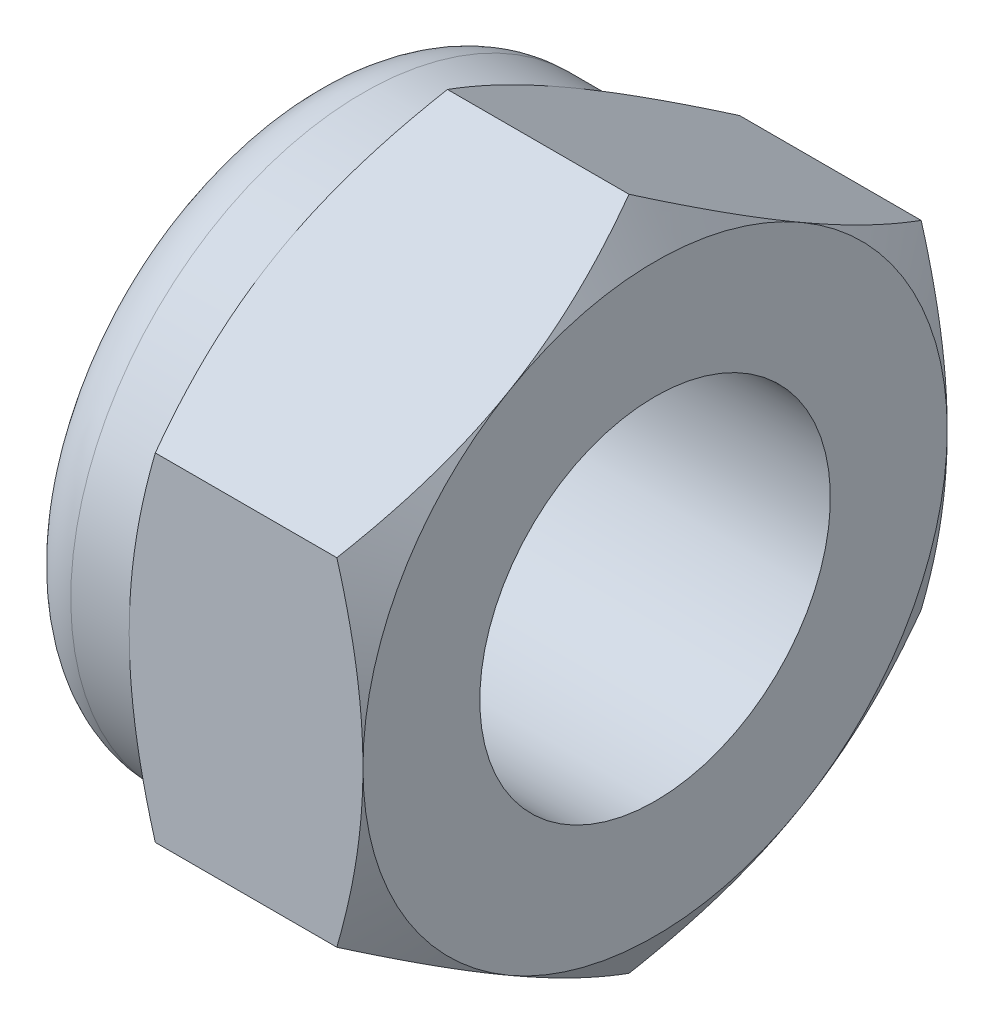
ISO-10303-21;
HEADER;
FILE_DESCRIPTION(('STEP AP214'),'2;1');
FILE_NAME('part.step','',(''),(''),'','','');
FILE_SCHEMA(('AUTOMOTIVE_DESIGN { 1 0 10303 214 1 1 1 1 }'));
ENDSEC;
DATA;
#1=APPLICATION_CONTEXT('core data for automotive mechanical design processes');
#2=APPLICATION_PROTOCOL_DEFINITION('international standard','automotive_design',2000,#1);
#3=PRODUCT_CONTEXT('',#1,'mechanical');
#4=PRODUCT('Part','Part','',(#3));
#5=PRODUCT_RELATED_PRODUCT_CATEGORY('part','',(#4));
#6=PRODUCT_DEFINITION_FORMATION('','',#4);
#7=PRODUCT_DEFINITION_CONTEXT('part definition',#1,'design');
#8=PRODUCT_DEFINITION('design','',#6,#7);
#9=PRODUCT_DEFINITION_SHAPE('','',#8);
#10=(LENGTH_UNIT() NAMED_UNIT(*) SI_UNIT(.MILLI.,.METRE.));
#11=(NAMED_UNIT(*) PLANE_ANGLE_UNIT() SI_UNIT($,.RADIAN.));
#12=(NAMED_UNIT(*) SI_UNIT($,.STERADIAN.) SOLID_ANGLE_UNIT());
#13=UNCERTAINTY_MEASURE_WITH_UNIT(LENGTH_MEASURE(1.E-05),#10,'distance_accuracy_value','');
#14=(GEOMETRIC_REPRESENTATION_CONTEXT(3) GLOBAL_UNCERTAINTY_ASSIGNED_CONTEXT((#13)) GLOBAL_UNIT_ASSIGNED_CONTEXT((#10,
#11,#12)) REPRESENTATION_CONTEXT('',''));
#15=CARTESIAN_POINT('',(0.,0.,0.));
#16=DIRECTION('',(0.,0.,1.));
#17=DIRECTION('',(1.,0.,0.));
#18=AXIS2_PLACEMENT_3D('',#15,#16,#17);
#19=CARTESIAN_POINT('',(-6.,2.88675134594813,-5.));
#20=DIRECTION('',(0.,0.866025403784439,-0.5));
#21=DIRECTION('',(0.,0.5,0.866025403784439));
#22=AXIS2_PLACEMENT_3D('',#19,#20,#21);
#23=PLANE('',#22);
#24=DIRECTION('',(1.,0.,0.));
#25=VECTOR('',#24,1.);
#26=CARTESIAN_POINT('',(-6.,2.88675134594813,-5.));
#27=LINE('',#26,#25);
#28=CARTESIAN_POINT('',(-3.5534180126148,2.88675134594813,-5.));
#29=VERTEX_POINT('',#28);
#30=CARTESIAN_POINT('',(-0.446581987385198,2.88675134594813,-5.));
#31=VERTEX_POINT('',#30);
#32=EDGE_CURVE('E160',#29,#31,#27,.T.);
#33=ORIENTED_EDGE('',*,*,#32,.F.);
#34=CARTESIAN_POINT('',(-3.55335134394818,2.88663587589429,-5.0002));
#35=CARTESIAN_POINT('',(-3.62661343236237,3.01349970319368,-4.78046540547481));
#36=CARTESIAN_POINT('',(-3.69324867808191,3.14144859993849,-4.55885141554042));
#37=CARTESIAN_POINT('',(-3.80956100898919,3.39956193532121,-4.11178600454649));
#38=CARTESIAN_POINT('',(-3.85919695008421,3.52973095989718,-3.88632664040923));
#39=CARTESIAN_POINT('',(-3.9364489745813,3.78847564779798,-3.43816769477649));
#40=CARTESIAN_POINT('',(-3.96457962171651,3.91701101576052,-3.21553790689581));
#41=CARTESIAN_POINT('',(-3.98980507804632,4.11026620624322,-2.88081009815336));
#42=CARTESIAN_POINT('',(-3.99538654023052,4.17472868879311,-2.76915780319494));
#43=CARTESIAN_POINT('',(-4.00079778324853,4.30371322717528,-2.5457500293262));
#44=CARTESIAN_POINT('',(-4.0006277417418,4.36823528110589,-2.43399455370969));
#45=CARTESIAN_POINT('',(-3.99224636820796,4.54500768479194,-2.12781576914936));
#46=CARTESIAN_POINT('',(-3.97817022810275,4.65719946015292,-1.93349391403279));
#47=CARTESIAN_POINT('',(-3.93353474289057,4.88083840557981,-1.5461398980023));
#48=CARTESIAN_POINT('',(-3.90296013985249,4.9922847895602,-1.35310909862843));
#49=CARTESIAN_POINT('',(-3.82653150637884,5.21637431361295,-0.964974657525147));
#50=CARTESIAN_POINT('',(-3.78035362112132,5.32898917185759,-0.769920001358265));
#51=CARTESIAN_POINT('',(-3.67554820550807,5.55253939626498,-0.382719654641233));
#52=CARTESIAN_POINT('',(-3.61694529656263,5.66347762579592,-0.190569004591914));
#53=CARTESIAN_POINT('',(-3.55335134394817,5.7736181619501,0.000199999999999449));
#54=B_SPLINE_CURVE_WITH_KNOTS('',3,(#34,#35,#36,#37,#38,#39,#40,#41,#42,#43,#44,#45,#46,#47,#48,
#49,#50,#51,#52,#53),.UNSPECIFIED.,.F.,.F.,(4,2,2,2,2,2,2,2,2,4),(0.,0.79255584136309,
1.58701660053333,2.3618153748728,2.74884076077325,3.13585419177295,3.80962362599679,
4.48401723901189,5.17336882348928,5.86136694793725),.UNSPECIFIED.);
#55=CARTESIAN_POINT('',(-4.,4.3301270189222,-2.5));
#56=VERTEX_POINT('',#55);
#57=EDGE_CURVE('E280',#29,#56,#54,.T.);
#58=ORIENTED_EDGE('',*,*,#57,.T.);
#59=CARTESIAN_POINT('',(-3.5534180126148,5.77350269189626,0.));
#60=VERTEX_POINT('',#59);
#61=EDGE_CURVE('E274',#56,#60,#54,.T.);
#62=ORIENTED_EDGE('',*,*,#61,.T.);
#63=DIRECTION('',(1.,0.,0.));
#64=VECTOR('',#63,1.);
#65=CARTESIAN_POINT('',(-6.,5.77350269189626,0.));
#66=LINE('',#65,#64);
#67=CARTESIAN_POINT('',(-0.446581987385199,5.77350269189626,0.));
#68=VERTEX_POINT('',#67);
#69=EDGE_CURVE('E167',#60,#68,#66,.T.);
#70=ORIENTED_EDGE('',*,*,#69,.T.);
#71=CARTESIAN_POINT('',(-0.446648656051826,5.7736181619501,0.000199999999999896));
#72=CARTESIAN_POINT('',(-0.373386567637632,5.64675433465071,-0.219534594525186));
#73=CARTESIAN_POINT('',(-0.30675132191809,5.5188054379059,-0.441148584459581));
#74=CARTESIAN_POINT('',(-0.19043899101081,5.26069210252318,-0.888213995453513));
#75=CARTESIAN_POINT('',(-0.140803049915788,5.13052307794721,-1.11367335959077));
#76=CARTESIAN_POINT('',(-0.063551025418698,4.87177839004641,-1.56183230522351));
#77=CARTESIAN_POINT('',(-0.0354203782834895,4.74324302208387,-1.78446209310419));
#78=CARTESIAN_POINT('',(-0.0101949219536849,4.54998783160116,-2.11918990184664));
#79=CARTESIAN_POINT('',(-0.00461345976948452,4.48552534905128,-2.23084219680506));
#80=CARTESIAN_POINT('',(0.000797783248529286,4.35654081066911,-2.4542499706738));
#81=CARTESIAN_POINT('',(0.000627741741796299,4.2920187567385,-2.56600544629031));
#82=CARTESIAN_POINT('',(-0.00775363179203673,4.11524635305244,-2.87218423085064));
#83=CARTESIAN_POINT('',(-0.021829771897252,4.00305457769146,-3.06650608596721));
#84=CARTESIAN_POINT('',(-0.066465257109431,3.77941563226458,-3.4538601019977));
#85=CARTESIAN_POINT('',(-0.0970398601475077,3.66796924828419,-3.64689090137157));
#86=CARTESIAN_POINT('',(-0.173468493621162,3.44387972423144,-4.03502534247485));
#87=CARTESIAN_POINT('',(-0.219646378878678,3.3312648659868,-4.23007999864173));
#88=CARTESIAN_POINT('',(-0.324451794491932,3.10771464157941,-4.61728034535877));
#89=CARTESIAN_POINT('',(-0.383054703437371,2.99677641204847,-4.80943099540808));
#90=CARTESIAN_POINT('',(-0.446648656051825,2.88663587589429,-5.0002));
#91=B_SPLINE_CURVE_WITH_KNOTS('',3,(#71,#72,#73,#74,#75,#76,#77,#78,#79,#80,#81,#82,#83,#84,#85,
#86,#87,#88,#89,#90),.UNSPECIFIED.,.F.,.F.,(4,2,2,2,2,2,2,2,2,4),(0.,0.792555841363089,
1.58701660053333,2.3618153748728,2.74884076077325,3.13585419177295,3.80962362599679,
4.48401723901189,5.17336882348928,5.86136694793725),.UNSPECIFIED.);
#92=CARTESIAN_POINT('',(0.,4.3301270189222,-2.5));
#93=VERTEX_POINT('',#92);
#94=EDGE_CURVE('E325',#68,#93,#91,.T.);
#95=ORIENTED_EDGE('',*,*,#94,.T.);
#96=EDGE_CURVE('E228',#93,#31,#91,.T.);
#97=ORIENTED_EDGE('',*,*,#96,.T.);
#98=EDGE_LOOP('',(#33,#58,#62,#70,#95,#97));
#99=FACE_BOUND('',#98,.T.);
#100=ADVANCED_FACE('F32',(#99),#23,.T.);
#101=CARTESIAN_POINT('',(-6.,-2.88675134594813,-5.));
#102=DIRECTION('',(0.,0.,-1.));
#103=DIRECTION('',(0.,1.,0.));
#104=AXIS2_PLACEMENT_3D('',#101,#102,#103);
#105=PLANE('',#104);
#106=DIRECTION('',(1.,0.,0.));
#107=VECTOR('',#106,1.);
#108=CARTESIAN_POINT('',(-6.,-2.88675134594813,-5.));
#109=LINE('',#108,#107);
#110=CARTESIAN_POINT('',(-3.5534180126148,-2.88675134594813,-4.99999999999999));
#111=VERTEX_POINT('',#110);
#112=CARTESIAN_POINT('',(-0.446581987385198,-2.88675134594813,-4.99999999999999));
#113=VERTEX_POINT('',#112);
#114=EDGE_CURVE('E157',#111,#113,#109,.T.);
#115=ORIENTED_EDGE('',*,*,#114,.F.);
#116=CARTESIAN_POINT('',(-1.60736561074587,-7.65609177212317,-5.));
#117=CARTESIAN_POINT('',(-1.71345383603734,-7.43656343758357,-5.));
#118=CARTESIAN_POINT('',(-1.81848745648448,-7.21651606414283,-5.));
#119=CARTESIAN_POINT('',(-2.02584285104625,-6.77510259917478,-5.));
#120=CARTESIAN_POINT('',(-2.12816415563485,-6.55373628734637,-5.));
#121=CARTESIAN_POINT('',(-2.33003131625317,-6.10820850200618,-5.));
#122=CARTESIAN_POINT('',(-2.42955793867598,-5.88403828224006,-5.));
#123=CARTESIAN_POINT('',(-2.62433627144146,-5.43385534806404,-5.));
#124=CARTESIAN_POINT('',(-2.71958820461569,-5.20784273042233,-5.));
#125=CARTESIAN_POINT('',(-2.90581130250878,-4.7508098249394,-5.));
#126=CARTESIAN_POINT('',(-2.99671555609043,-4.5197621235661,-5.));
#127=CARTESIAN_POINT('',(-3.17140441293615,-4.05494131662996,-5.));
#128=CARTESIAN_POINT('',(-3.25518822408778,-3.82116791112762,-5.));
#129=CARTESIAN_POINT('',(-3.41338518049779,-3.35100475142416,-5.));
#130=CARTESIAN_POINT('',(-3.48781824774764,-3.11462176833116,-5.));
#131=CARTESIAN_POINT('',(-3.62489550422514,-2.63849286059447,-5.));
#132=CARTESIAN_POINT('',(-3.68754342151799,-2.39874802529956,-5.));
#133=CARTESIAN_POINT('',(-3.79801221973906,-1.91574317494575,-5.));
#134=CARTESIAN_POINT('',(-3.84582915057248,-1.67248224143162,-5.));
#135=CARTESIAN_POINT('',(-3.92340447175773,-1.18299341060266,-5.));
#136=CARTESIAN_POINT('',(-3.95316284615529,-0.936765510666786,-5.));
#137=CARTESIAN_POINT('',(-3.9823488291451,-0.567031819079377,-5.));
#138=CARTESIAN_POINT('',(-3.98950370802071,-0.444104782955956,-5.));
#139=CARTESIAN_POINT('',(-3.99860456276109,-0.198052381774449,-5.));
#140=CARTESIAN_POINT('',(-4.0005506062699,-0.0749270193126857,-5.));
#141=CARTESIAN_POINT('',(-3.99918151488384,0.171258785818514,-5.));
#142=CARTESIAN_POINT('',(-3.99586785791503,0.294319237008563,-5.));
#143=CARTESIAN_POINT('',(-3.98406334471061,0.540193677552172,-5.));
#144=CARTESIAN_POINT('',(-3.97557222718951,0.663007654153308,-5.));
#145=CARTESIAN_POINT('',(-3.94889350203737,0.960682957245838,-5.));
#146=CARTESIAN_POINT('',(-3.92811089000246,1.13531547825311,-5.));
#147=CARTESIAN_POINT('',(-3.87723415140654,1.48321793429818,-5.));
#148=CARTESIAN_POINT('',(-3.84713878317962,1.65648768447755,-5.));
#149=CARTESIAN_POINT('',(-3.77870093677783,2.00155552519325,-5.));
#150=CARTESIAN_POINT('',(-3.74035022487923,2.17335196708859,-5.));
#151=CARTESIAN_POINT('',(-3.65657134433362,2.51518303239447,-5.));
#152=CARTESIAN_POINT('',(-3.61114360658131,2.68521776239755,-5.));
#153=CARTESIAN_POINT('',(-3.51311178880933,3.02770462413248,-5.));
#154=CARTESIAN_POINT('',(-3.46035918063097,3.20011394779934,-5.));
#155=CARTESIAN_POINT('',(-3.349641705112,3.54311022463379,-5.));
#156=CARTESIAN_POINT('',(-3.29168043287631,3.71369834521276,-5.));
#157=CARTESIAN_POINT('',(-3.17174287579222,4.05236770745105,-5.));
#158=CARTESIAN_POINT('',(-3.10979102646219,4.22045765494591,-5.));
#159=CARTESIAN_POINT('',(-2.98225110922803,4.55533340532883,-5.));
#160=CARTESIAN_POINT('',(-2.91666157168731,4.72211864960304,-5.));
#161=CARTESIAN_POINT('',(-2.84961303777573,4.88829798170485,-5.));
#162=B_SPLINE_CURVE_WITH_KNOTS('',3,(#116,#117,#118,#119,#120,#121,#122,#123,#124,#125,#126,
#127,#128,#129,#130,#131,#132,#133,#134,#135,#136,#137,#138,#139,#140,#141,#142,#143,#144,#145,
#146,#147,#148,#149,#150,#151,#152,#153,#154,#155,#156,#157,#158,#159,#160,#161),.UNSPECIFIED.,
.F.,.F.,(4,2,2,2,2,2,2,2,2,2,2,2,2,2,2,2,2,2,2,2,2,2,4),(0.,0.731464953869326,1.4630557146924,
2.19883307522443,2.93457203639889,3.67934358933834,4.42419788610861,5.16743732301152,
5.91044124982453,6.65364289920091,7.39684520517622,7.76615669447499,8.13546338772165,
8.50466632765175,8.87388790130249,9.40118856909615,9.92855957198324,10.4564590222235,
10.9843263431151,11.5251238300906,12.0655508754377,12.6029360338292,13.1405399016667),.UNSPECIFIED.);
#163=CARTESIAN_POINT('',(-4.,0.,-5.));
#164=VERTEX_POINT('',#163);
#165=EDGE_CURVE('E150',#111,#164,#162,.T.);
#166=ORIENTED_EDGE('',*,*,#165,.T.);
#167=EDGE_CURVE('E243',#164,#29,#162,.T.);
#168=ORIENTED_EDGE('',*,*,#167,.T.);
#169=ORIENTED_EDGE('',*,*,#32,.T.);
#170=CARTESIAN_POINT('',(-2.39263438925413,-7.65609177212317,-5.));
#171=CARTESIAN_POINT('',(-2.28654616396266,-7.43656343758357,-5.));
#172=CARTESIAN_POINT('',(-2.18151254351552,-7.21651606414283,-5.));
#173=CARTESIAN_POINT('',(-1.97415714895375,-6.77510259917478,-5.));
#174=CARTESIAN_POINT('',(-1.87183584436515,-6.55373628734637,-5.));
#175=CARTESIAN_POINT('',(-1.66996868374683,-6.10820850200618,-5.));
#176=CARTESIAN_POINT('',(-1.57044206132402,-5.88403828224006,-5.));
#177=CARTESIAN_POINT('',(-1.37566372855854,-5.43385534806404,-5.));
#178=CARTESIAN_POINT('',(-1.28041179538431,-5.20784273042234,-5.));
#179=CARTESIAN_POINT('',(-1.09418869749122,-4.7508098249394,-5.));
#180=CARTESIAN_POINT('',(-1.00328444390957,-4.5197621235661,-5.));
#181=CARTESIAN_POINT('',(-0.828595587063853,-4.05494131662996,-5.));
#182=CARTESIAN_POINT('',(-0.744811775912222,-3.82116791112762,-5.));
#183=CARTESIAN_POINT('',(-0.586614819502208,-3.35100475142416,-5.));
#184=CARTESIAN_POINT('',(-0.512181752252363,-3.11462176833116,-5.));
#185=CARTESIAN_POINT('',(-0.375104495774864,-2.63849286059447,-5.));
#186=CARTESIAN_POINT('',(-0.312456578482012,-2.39874802529956,-5.));
#187=CARTESIAN_POINT('',(-0.201987780260941,-1.91574317494575,-5.));
#188=CARTESIAN_POINT('',(-0.15417084942752,-1.67248224143162,-5.));
#189=CARTESIAN_POINT('',(-0.0765955282422652,-1.18299341060266,-5.));
#190=CARTESIAN_POINT('',(-0.0468371538447104,-0.936765510666786,-5.));
#191=CARTESIAN_POINT('',(-0.017651170854896,-0.567031819079377,-5.));
#192=CARTESIAN_POINT('',(-0.0104962919792862,-0.444104782955956,-5.));
#193=CARTESIAN_POINT('',(-0.00139543723891507,-0.198052381774448,-5.));
#194=CARTESIAN_POINT('',(0.000550606269895689,-0.0749270193126856,-5.));
#195=CARTESIAN_POINT('',(-0.000818485116157086,0.171258785818514,-5.));
#196=CARTESIAN_POINT('',(-0.0041321420849662,0.294319237008563,-5.));
#197=CARTESIAN_POINT('',(-0.0159366552893928,0.540193677552172,-5.));
#198=CARTESIAN_POINT('',(-0.0244277728104931,0.663007654153308,-5.));
#199=CARTESIAN_POINT('',(-0.0511064979626268,0.960682957245837,-5.));
#200=CARTESIAN_POINT('',(-0.0718891099975366,1.13531547825311,-5.));
#201=CARTESIAN_POINT('',(-0.122765848593457,1.48321793429818,-5.));
#202=CARTESIAN_POINT('',(-0.152861216820383,1.65648768447755,-5.));
#203=CARTESIAN_POINT('',(-0.221299063222171,2.00155552519325,-5.));
#204=CARTESIAN_POINT('',(-0.259649775120775,2.17335196708859,-5.));
#205=CARTESIAN_POINT('',(-0.343428655666377,2.51518303239447,-5.));
#206=CARTESIAN_POINT('',(-0.388856393418686,2.68521776239755,-5.));
#207=CARTESIAN_POINT('',(-0.48688821119067,3.02770462413248,-5.));
#208=CARTESIAN_POINT('',(-0.539640819369028,3.20011394779934,-5.));
#209=CARTESIAN_POINT('',(-0.650358294888002,3.54311022463379,-5.));
#210=CARTESIAN_POINT('',(-0.708319567123689,3.71369834521276,-5.));
#211=CARTESIAN_POINT('',(-0.828257124207779,4.05236770745105,-5.));
#212=CARTESIAN_POINT('',(-0.890208973537807,4.22045765494591,-5.));
#213=CARTESIAN_POINT('',(-1.01774889077198,4.55533340532883,-5.));
#214=CARTESIAN_POINT('',(-1.08333842831269,4.72211864960304,-5.));
#215=CARTESIAN_POINT('',(-1.15038696222427,4.88829798170485,-5.));
#216=B_SPLINE_CURVE_WITH_KNOTS('',3,(#170,#171,#172,#173,#174,#175,#176,#177,#178,#179,#180,
#181,#182,#183,#184,#185,#186,#187,#188,#189,#190,#191,#192,#193,#194,#195,#196,#197,#198,#199,
#200,#201,#202,#203,#204,#205,#206,#207,#208,#209,#210,#211,#212,#213,#214,#215),.UNSPECIFIED.,
.F.,.F.,(4,2,2,2,2,2,2,2,2,2,2,2,2,2,2,2,2,2,2,2,2,2,4),(0.,0.731464953869325,1.4630557146924,
2.19883307522443,2.93457203639889,3.67934358933834,4.42419788610861,5.16743732301152,
5.91044124982453,6.65364289920091,7.39684520517622,7.76615669447499,8.13546338772165,
8.50466632765175,8.87388790130249,9.40118856909615,9.92855957198324,10.4564590222235,
10.9843263431151,11.5251238300906,12.0655508754377,12.6029360338292,13.1405399016667),.UNSPECIFIED.);
#217=CARTESIAN_POINT('',(0.,0.,-5.));
#218=VERTEX_POINT('',#217);
#219=EDGE_CURVE('E226',#31,#218,#216,.F.);
#220=ORIENTED_EDGE('',*,*,#219,.T.);
#221=EDGE_CURVE('E219',#218,#113,#216,.F.);
#222=ORIENTED_EDGE('',*,*,#221,.T.);
#223=EDGE_LOOP('',(#115,#166,#168,#169,#220,#222));
#224=FACE_BOUND('',#223,.T.);
#225=ADVANCED_FACE('F234',(#224),#105,.T.);
#226=CARTESIAN_POINT('',(-6.,-5.77350269189626,0.));
#227=DIRECTION('',(0.,-0.866025403784439,-0.5));
#228=DIRECTION('',(0.,0.5,-0.866025403784439));
#229=AXIS2_PLACEMENT_3D('',#226,#227,#228);
#230=PLANE('',#229);
#231=DIRECTION('',(1.,0.,0.));
#232=VECTOR('',#231,1.);
#233=CARTESIAN_POINT('',(-6.,-5.77350269189626,0.));
#234=LINE('',#233,#232);
#235=CARTESIAN_POINT('',(-3.5534180126148,-5.77350269189626,0.));
#236=VERTEX_POINT('',#235);
#237=CARTESIAN_POINT('',(-0.446581987385197,-5.77350269189626,0.));
#238=VERTEX_POINT('',#237);
#239=EDGE_CURVE('E147',#236,#238,#234,.T.);
#240=ORIENTED_EDGE('',*,*,#239,.F.);
#241=CARTESIAN_POINT('',(-3.55335134394817,-5.7736181619501,0.000200000000001459));
#242=CARTESIAN_POINT('',(-3.62661343236237,-5.64675433465071,-0.219534594525183));
#243=CARTESIAN_POINT('',(-3.69324867808191,-5.5188054379059,-0.441148584459579));
#244=CARTESIAN_POINT('',(-3.80956100898919,-5.26069210252318,-0.888213995453512));
#245=CARTESIAN_POINT('',(-3.85919695008421,-5.13052307794721,-1.11367335959077));
#246=CARTESIAN_POINT('',(-3.9364489745813,-4.87177839004641,-1.56183230522351));
#247=CARTESIAN_POINT('',(-3.96457962171651,-4.74324302208387,-1.78446209310419));
#248=CARTESIAN_POINT('',(-3.98980507804631,-4.54998783160116,-2.11918990184664));
#249=CARTESIAN_POINT('',(-3.99538654023052,-4.48552534905128,-2.23084219680506));
#250=CARTESIAN_POINT('',(-4.00079778324853,-4.35654081066911,-2.4542499706738));
#251=CARTESIAN_POINT('',(-4.00062774174179,-4.2920187567385,-2.56600544629031));
#252=CARTESIAN_POINT('',(-3.99224636820796,-4.11524635305245,-2.87218423085064));
#253=CARTESIAN_POINT('',(-3.97817022810275,-4.00305457769146,-3.06650608596721));
#254=CARTESIAN_POINT('',(-3.93353474289057,-3.77941563226458,-3.4538601019977));
#255=CARTESIAN_POINT('',(-3.90296013985249,-3.66796924828419,-3.64689090137157));
#256=CARTESIAN_POINT('',(-3.82653150637884,-3.44387972423144,-4.03502534247485));
#257=CARTESIAN_POINT('',(-3.78035362112132,-3.3312648659868,-4.23007999864173));
#258=CARTESIAN_POINT('',(-3.67554820550807,-3.10771464157941,-4.61728034535877));
#259=CARTESIAN_POINT('',(-3.61694529656263,-2.99677641204847,-4.80943099540809));
#260=CARTESIAN_POINT('',(-3.55335134394817,-2.88663587589429,-5.0002));
#261=B_SPLINE_CURVE_WITH_KNOTS('',3,(#241,#242,#243,#244,#245,#246,#247,#248,#249,#250,#251,
#252,#253,#254,#255,#256,#257,#258,#259,#260),.UNSPECIFIED.,.F.,.F.,(4,2,2,2,2,2,2,2,2,4),(0.,
0.79255584136309,1.58701660053333,2.3618153748728,2.74884076077325,3.13585419177295,
3.80962362599679,4.48401723901189,5.17336882348928,5.86136694793725),.UNSPECIFIED.);
#262=CARTESIAN_POINT('',(-4.,-4.3301270189222,-2.5));
#263=VERTEX_POINT('',#262);
#264=EDGE_CURVE('E129',#236,#263,#261,.T.);
#265=ORIENTED_EDGE('',*,*,#264,.T.);
#266=EDGE_CURVE('E140',#263,#111,#261,.T.);
#267=ORIENTED_EDGE('',*,*,#266,.T.);
#268=ORIENTED_EDGE('',*,*,#114,.T.);
#269=CARTESIAN_POINT('',(-0.446648656051827,-2.88663587589429,-5.0002));
#270=CARTESIAN_POINT('',(-0.373386567637633,-3.01349970319368,-4.78046540547482));
#271=CARTESIAN_POINT('',(-0.30675132191809,-3.14144859993849,-4.55885141554042));
#272=CARTESIAN_POINT('',(-0.19043899101081,-3.39956193532121,-4.11178600454649));
#273=CARTESIAN_POINT('',(-0.140803049915789,-3.52973095989718,-3.88632664040923));
#274=CARTESIAN_POINT('',(-0.0635510254186985,-3.78847564779798,-3.43816769477649));
#275=CARTESIAN_POINT('',(-0.0354203782834904,-3.91701101576052,-3.21553790689581));
#276=CARTESIAN_POINT('',(-0.0101949219536854,-4.11026620624323,-2.88081009815336));
#277=CARTESIAN_POINT('',(-0.00461345976948476,-4.17472868879311,-2.76915780319494));
#278=CARTESIAN_POINT('',(0.00079778324852896,-4.30371322717528,-2.5457500293262));
#279=CARTESIAN_POINT('',(0.000627741741795596,-4.36823528110589,-2.43399455370969));
#280=CARTESIAN_POINT('',(-0.00775363179203767,-4.54500768479194,-2.12781576914936));
#281=CARTESIAN_POINT('',(-0.0218297718972523,-4.65719946015293,-1.93349391403279));
#282=CARTESIAN_POINT('',(-0.0664652571094309,-4.88083840557981,-1.54613989800229));
#283=CARTESIAN_POINT('',(-0.097039860147508,-4.9922847895602,-1.35310909862843));
#284=CARTESIAN_POINT('',(-0.173468493621163,-5.21637431361295,-0.964974657525146));
#285=CARTESIAN_POINT('',(-0.219646378878679,-5.32898917185759,-0.769920001358264));
#286=CARTESIAN_POINT('',(-0.324451794491933,-5.55253939626498,-0.382719654641231));
#287=CARTESIAN_POINT('',(-0.383054703437372,-5.66347762579592,-0.190569004591913));
#288=CARTESIAN_POINT('',(-0.446648656051826,-5.7736181619501,0.000200000000000957));
#289=B_SPLINE_CURVE_WITH_KNOTS('',3,(#269,#270,#271,#272,#273,#274,#275,#276,#277,#278,#279,
#280,#281,#282,#283,#284,#285,#286,#287,#288),.UNSPECIFIED.,.F.,.F.,(4,2,2,2,2,2,2,2,2,4),(0.,
0.79255584136309,1.58701660053333,2.3618153748728,2.74884076077325,3.13585419177295,
3.80962362599679,4.48401723901189,5.17336882348928,5.86136694793725),.UNSPECIFIED.);
#290=CARTESIAN_POINT('',(0.,-4.3301270189222,-2.5));
#291=VERTEX_POINT('',#290);
#292=EDGE_CURVE('E227',#113,#291,#289,.T.);
#293=ORIENTED_EDGE('',*,*,#292,.T.);
#294=EDGE_CURVE('E156',#291,#238,#289,.T.);
#295=ORIENTED_EDGE('',*,*,#294,.T.);
#296=EDGE_LOOP('',(#240,#265,#267,#268,#293,#295));
#297=FACE_BOUND('',#296,.T.);
#298=ADVANCED_FACE('F153',(#297),#230,.T.);
#299=CARTESIAN_POINT('',(-6.,-2.88675134594813,5.));
#300=DIRECTION('',(0.,-0.866025403784438,0.5));
#301=DIRECTION('',(0.,-0.5,-0.866025403784439));
#302=AXIS2_PLACEMENT_3D('',#299,#300,#301);
#303=PLANE('',#302);
#304=DIRECTION('',(1.,0.,0.));
#305=VECTOR('',#304,1.);
#306=CARTESIAN_POINT('',(-6.,-2.88675134594813,5.));
#307=LINE('',#306,#305);
#308=CARTESIAN_POINT('',(-3.5534180126148,-2.88675134594813,5.));
#309=VERTEX_POINT('',#308);
#310=CARTESIAN_POINT('',(-0.446581987385198,-2.88675134594812,5.));
#311=VERTEX_POINT('',#310);
#312=EDGE_CURVE('E158',#309,#311,#307,.T.);
#313=ORIENTED_EDGE('',*,*,#312,.F.);
#314=CARTESIAN_POINT('',(-3.55335134394817,-2.88663587589429,5.0002));
#315=CARTESIAN_POINT('',(-3.62661343236237,-3.01349970319368,4.78046540547482));
#316=CARTESIAN_POINT('',(-3.69324867808191,-3.14144859993849,4.55885141554042));
#317=CARTESIAN_POINT('',(-3.80956100898919,-3.39956193532121,4.11178600454649));
#318=CARTESIAN_POINT('',(-3.85919695008421,-3.52973095989718,3.88632664040923));
#319=CARTESIAN_POINT('',(-3.9364489745813,-3.78847564779798,3.43816769477649));
#320=CARTESIAN_POINT('',(-3.96457962171651,-3.91701101576052,3.21553790689581));
#321=CARTESIAN_POINT('',(-3.98980507804631,-4.11026620624323,2.88081009815336));
#322=CARTESIAN_POINT('',(-3.99538654023052,-4.17472868879311,2.76915780319494));
#323=CARTESIAN_POINT('',(-4.00079778324853,-4.30371322717528,2.5457500293262));
#324=CARTESIAN_POINT('',(-4.0006277417418,-4.36823528110589,2.43399455370969));
#325=CARTESIAN_POINT('',(-3.99224636820796,-4.54500768479194,2.12781576914936));
#326=CARTESIAN_POINT('',(-3.97817022810275,-4.65719946015293,1.93349391403279));
#327=CARTESIAN_POINT('',(-3.93353474289057,-4.88083840557981,1.5461398980023));
#328=CARTESIAN_POINT('',(-3.90296013985249,-4.9922847895602,1.35310909862843));
#329=CARTESIAN_POINT('',(-3.82653150637884,-5.21637431361295,0.964974657525147));
#330=CARTESIAN_POINT('',(-3.78035362112132,-5.32898917185759,0.769920001358265));
#331=CARTESIAN_POINT('',(-3.67554820550807,-5.55253939626498,0.382719654641232));
#332=CARTESIAN_POINT('',(-3.61694529656263,-5.66347762579592,0.190569004591914));
#333=CARTESIAN_POINT('',(-3.55335134394817,-5.7736181619501,-0.000199999999998698));
#334=B_SPLINE_CURVE_WITH_KNOTS('',3,(#314,#315,#316,#317,#318,#319,#320,#321,#322,#323,#324,
#325,#326,#327,#328,#329,#330,#331,#332,#333),.UNSPECIFIED.,.F.,.F.,(4,2,2,2,2,2,2,2,2,4),(0.,
0.79255584136309,1.58701660053333,2.3618153748728,2.74884076077325,3.13585419177295,
3.80962362599679,4.48401723901189,5.17336882348928,5.86136694793725),.UNSPECIFIED.);
#335=CARTESIAN_POINT('',(-4.,-4.33012701892219,2.5));
#336=VERTEX_POINT('',#335);
#337=EDGE_CURVE('E149',#309,#336,#334,.T.);
#338=ORIENTED_EDGE('',*,*,#337,.T.);
#339=EDGE_CURVE('E132',#336,#236,#334,.T.);
#340=ORIENTED_EDGE('',*,*,#339,.T.);
#341=ORIENTED_EDGE('',*,*,#239,.T.);
#342=CARTESIAN_POINT('',(-0.446648656051827,-5.7736181619501,-0.000199999999998579));
#343=CARTESIAN_POINT('',(-0.373386567637633,-5.64675433465071,0.219534594525186));
#344=CARTESIAN_POINT('',(-0.30675132191809,-5.5188054379059,0.441148584459582));
#345=CARTESIAN_POINT('',(-0.19043899101081,-5.26069210252318,0.888213995453514));
#346=CARTESIAN_POINT('',(-0.140803049915789,-5.13052307794721,1.11367335959077));
#347=CARTESIAN_POINT('',(-0.0635510254186983,-4.87177839004641,1.56183230522351));
#348=CARTESIAN_POINT('',(-0.0354203782834897,-4.74324302208387,1.78446209310419));
#349=CARTESIAN_POINT('',(-0.010194921953685,-4.54998783160116,2.11918990184664));
#350=CARTESIAN_POINT('',(-0.00461345976948461,-4.48552534905128,2.23084219680506));
#351=CARTESIAN_POINT('',(0.000797783248528886,-4.35654081066911,2.4542499706738));
#352=CARTESIAN_POINT('',(0.000627741741795569,-4.2920187567385,2.56600544629031));
#353=CARTESIAN_POINT('',(-0.00775363179203759,-4.11524635305244,2.87218423085064));
#354=CARTESIAN_POINT('',(-0.0218297718972522,-4.00305457769146,3.06650608596721));
#355=CARTESIAN_POINT('',(-0.066465257109431,-3.77941563226457,3.45386010199771));
#356=CARTESIAN_POINT('',(-0.0970398601475081,-3.66796924828418,3.64689090137157));
#357=CARTESIAN_POINT('',(-0.173468493621163,-3.44387972423144,4.03502534247485));
#358=CARTESIAN_POINT('',(-0.219646378878679,-3.3312648659868,4.23007999864174));
#359=CARTESIAN_POINT('',(-0.324451794491932,-3.1077146415794,4.61728034535877));
#360=CARTESIAN_POINT('',(-0.383054703437371,-2.99677641204847,4.80943099540809));
#361=CARTESIAN_POINT('',(-0.446648656051826,-2.88663587589429,5.0002));
#362=B_SPLINE_CURVE_WITH_KNOTS('',3,(#342,#343,#344,#345,#346,#347,#348,#349,#350,#351,#352,
#353,#354,#355,#356,#357,#358,#359,#360,#361),.UNSPECIFIED.,.F.,.F.,(4,2,2,2,2,2,2,2,2,4),(0.,
0.79255584136309,1.58701660053333,2.3618153748728,2.74884076077325,3.13585419177295,
3.80962362599679,4.48401723901189,5.17336882348928,5.86136694793725),.UNSPECIFIED.);
#363=CARTESIAN_POINT('',(0.,-4.33012701892219,2.5));
#364=VERTEX_POINT('',#363);
#365=EDGE_CURVE('E298',#238,#364,#362,.T.);
#366=ORIENTED_EDGE('',*,*,#365,.T.);
#367=EDGE_CURVE('E206',#364,#311,#362,.T.);
#368=ORIENTED_EDGE('',*,*,#367,.T.);
#369=EDGE_LOOP('',(#313,#338,#340,#341,#366,#368));
#370=FACE_BOUND('',#369,.T.);
#371=ADVANCED_FACE('F145',(#370),#303,.T.);
#372=CARTESIAN_POINT('',(-6.,2.88675134594813,5.));
#373=DIRECTION('',(0.,0.,1.));
#374=DIRECTION('',(0.,-1.,0.));
#375=AXIS2_PLACEMENT_3D('',#372,#373,#374);
#376=PLANE('',#375);
#377=DIRECTION('',(1.,0.,0.));
#378=VECTOR('',#377,1.);
#379=CARTESIAN_POINT('',(-6.,2.88675134594813,5.));
#380=LINE('',#379,#378);
#381=CARTESIAN_POINT('',(-3.5534180126148,2.88675134594813,5.));
#382=VERTEX_POINT('',#381);
#383=CARTESIAN_POINT('',(-0.446581987385198,2.88675134594814,4.99999999999999));
#384=VERTEX_POINT('',#383);
#385=EDGE_CURVE('E162',#382,#384,#380,.T.);
#386=ORIENTED_EDGE('',*,*,#385,.F.);
#387=CARTESIAN_POINT('',(-1.60736647344924,-7.65608998744864,5.));
#388=CARTESIAN_POINT('',(-1.71345466182796,-7.43656171400165,5.));
#389=CARTESIAN_POINT('',(-1.81848824538408,-7.21651440170021,5.));
#390=CARTESIAN_POINT('',(-2.02584356636027,-6.77510105921518,5.));
#391=CARTESIAN_POINT('',(-2.12816483425435,-6.55373480873052,5.));
#392=CARTESIAN_POINT('',(-2.33003192146512,-6.10820714710356,5.));
#393=CARTESIAN_POINT('',(-2.42955850718272,-5.88403698971124,5.));
#394=CARTESIAN_POINT('',(-2.62433676721321,-5.43385418074676,5.));
#395=CARTESIAN_POINT('',(-2.71958866435759,-5.20784162594277,5.));
#396=CARTESIAN_POINT('',(-2.9058116908106,-4.75080884782755,5.));
#397=CARTESIAN_POINT('',(-2.99671590900132,-4.51976121099504,5.));
#398=CARTESIAN_POINT('',(-3.17140469702806,-4.05494053422099,5.));
#399=CARTESIAN_POINT('',(-3.25518847475236,-3.82116719434024,5.));
#400=CARTESIAN_POINT('',(-3.41338536763539,-3.35100416711889,5.));
#401=CARTESIAN_POINT('',(-3.48781840477474,-3.11462125088187,5.));
#402=CARTESIAN_POINT('',(-3.62489560612763,-2.63849247870023,5.));
#403=CARTESIAN_POINT('',(-3.68754349840306,-2.3987477121033,5.));
#404=CARTESIAN_POINT('',(-3.79801224600513,-1.91574303714497,5.));
#405=CARTESIAN_POINT('',(-3.84582915344136,-1.672482210841,5.));
#406=CARTESIAN_POINT('',(-3.9234044442076,-1.18299359688664,5.));
#407=CARTESIAN_POINT('',(-3.95316281157159,-0.93676580661328,5.));
#408=CARTESIAN_POINT('',(-3.9823487984137,-0.567032279323847,5.));
#409=CARTESIAN_POINT('',(-3.98950368094005,-0.44410529765854,5.));
#410=CARTESIAN_POINT('',(-3.99860454773096,-0.198053005238565,5.));
#411=CARTESIAN_POINT('',(-4.00055059963961,-0.0749276970802289,5.));
#412=CARTESIAN_POINT('',(-3.99918152965434,0.171257999892353,5.));
#413=CARTESIAN_POINT('',(-3.99586788568699,0.294318397227088,5.));
#414=CARTESIAN_POINT('',(-3.98406340271724,0.54019273078884,5.));
#415=CARTESIAN_POINT('',(-3.97557230242983,0.663006654263483,5.));
#416=CARTESIAN_POINT('',(-3.9488936197247,0.960681872881669,5.));
#417=CARTESIAN_POINT('',(-3.92811103230171,1.1353143627994,5.));
#418=CARTESIAN_POINT('',(-3.8772343442773,1.4832167579939,5.));
#419=CARTESIAN_POINT('',(-3.84713900200996,1.65648647841238,5.));
#420=CARTESIAN_POINT('',(-3.77870120798845,2.00155426058701,5.));
#421=CARTESIAN_POINT('',(-3.74035052251359,2.17335067370376,5.));
#422=CARTESIAN_POINT('',(-3.65657169461498,2.51518168221057,5.));
#423=CARTESIAN_POINT('',(-3.61114398308599,2.68521638419314,5.));
#424=CARTESIAN_POINT('',(-3.5131122179457,3.02770318928896,5.));
#425=CARTESIAN_POINT('',(-3.46035963617605,3.20011248435316,5.));
#426=CARTESIAN_POINT('',(-3.34964221269737,3.54310870430182,5.));
#427=CARTESIAN_POINT('',(-3.29168096609292,3.7136967965972,5.));
#428=CARTESIAN_POINT('',(-3.17174345927152,4.0523661026798,5.));
#429=CARTESIAN_POINT('',(-3.10979163457362,4.22045602230062,5.));
#430=CARTESIAN_POINT('',(-2.98225176586187,4.55533171687455,5.));
#431=CARTESIAN_POINT('',(-2.91666225221222,4.72211693321422,5.));
#432=CARTESIAN_POINT('',(-2.84961374182274,4.88829623733363,5.));
#433=B_SPLINE_CURVE_WITH_KNOTS('',3,(#387,#388,#389,#390,#391,#392,#393,#394,#395,#396,#397,
#398,#399,#400,#401,#402,#403,#404,#405,#406,#407,#408,#409,#410,#411,#412,#413,#414,#415,#416,
#417,#418,#419,#420,#421,#422,#423,#424,#425,#426,#427,#428,#429,#430,#431,#432),.UNSPECIFIED.,
.F.,.F.,(4,2,2,2,2,2,2,2,2,2,2,2,2,2,2,2,2,2,2,2,2,2,4),(0.,0.731464740665351,1.46305528824908,
2.19883243307485,2.93457117856033,3.67934251246857,4.4241965901336,5.16743580871988,
5.91043951739337,6.65364083834805,7.39684281638514,7.76615414335454,8.13546067426608,
8.50466345177854,8.87388486298451,9.40118542949726,9.92855633110015,10.4564556797854,
10.9843228991235,11.525120280828,12.065547221064,12.6029322754131,13.1405360390026),.UNSPECIFIED.);
#434=CARTESIAN_POINT('',(-4.,0.,5.));
#435=VERTEX_POINT('',#434);
#436=EDGE_CURVE('E52',#382,#435,#433,.F.);
#437=ORIENTED_EDGE('',*,*,#436,.T.);
#438=EDGE_CURVE('E284',#435,#309,#433,.F.);
#439=ORIENTED_EDGE('',*,*,#438,.T.);
#440=ORIENTED_EDGE('',*,*,#312,.T.);
#441=CARTESIAN_POINT('',(-2.39263352655076,-7.65608998744865,5.));
#442=CARTESIAN_POINT('',(-2.28654533817204,-7.43656171400166,5.));
#443=CARTESIAN_POINT('',(-2.18151175461592,-7.21651440170021,5.));
#444=CARTESIAN_POINT('',(-1.97415643363973,-6.77510105921518,5.));
#445=CARTESIAN_POINT('',(-1.87183516574565,-6.55373480873052,5.));
#446=CARTESIAN_POINT('',(-1.66996807853488,-6.10820714710356,5.));
#447=CARTESIAN_POINT('',(-1.57044149281728,-5.88403698971124,5.));
#448=CARTESIAN_POINT('',(-1.37566323278679,-5.43385418074676,5.));
#449=CARTESIAN_POINT('',(-1.28041133564241,-5.20784162594278,5.));
#450=CARTESIAN_POINT('',(-1.0941883091894,-4.75080884782755,5.));
#451=CARTESIAN_POINT('',(-1.00328409099868,-4.51976121099505,5.));
#452=CARTESIAN_POINT('',(-0.828595302971936,-4.05494053422099,5.));
#453=CARTESIAN_POINT('',(-0.74481152524764,-3.82116719434024,5.));
#454=CARTESIAN_POINT('',(-0.58661463236461,-3.35100416711889,5.));
#455=CARTESIAN_POINT('',(-0.512181595225263,-3.11462125088187,5.));
#456=CARTESIAN_POINT('',(-0.375104393872371,-2.63849247870023,5.));
#457=CARTESIAN_POINT('',(-0.312456501596945,-2.3987477121033,5.));
#458=CARTESIAN_POINT('',(-0.201987753994866,-1.91574303714497,5.));
#459=CARTESIAN_POINT('',(-0.15417084655864,-1.67248221084099,5.));
#460=CARTESIAN_POINT('',(-0.0765955557924019,-1.18299359688664,5.));
#461=CARTESIAN_POINT('',(-0.0468371884284092,-0.936765806613279,5.));
#462=CARTESIAN_POINT('',(-0.0176512015862968,-0.567032279323846,5.));
#463=CARTESIAN_POINT('',(-0.0104963190599474,-0.444105297658538,5.));
#464=CARTESIAN_POINT('',(-0.0013954522690415,-0.198053005238565,5.));
#465=CARTESIAN_POINT('',(0.00055059963961365,-0.0749276970802286,5.));
#466=CARTESIAN_POINT('',(-0.000818470345664742,0.171257999892352,5.));
#467=CARTESIAN_POINT('',(-0.00413211431301199,0.294318397227087,5.));
#468=CARTESIAN_POINT('',(-0.0159365972827603,0.540192730788839,5.));
#469=CARTESIAN_POINT('',(-0.0244276975701655,0.663006654263482,5.));
#470=CARTESIAN_POINT('',(-0.0511063802753016,0.960681872881669,5.));
#471=CARTESIAN_POINT('',(-0.071888967698287,1.1353143627994,5.));
#472=CARTESIAN_POINT('',(-0.122765655722696,1.4832167579939,5.));
#473=CARTESIAN_POINT('',(-0.152860997990035,1.65648647841238,5.));
#474=CARTESIAN_POINT('',(-0.221298792011554,2.00155426058701,5.));
#475=CARTESIAN_POINT('',(-0.259649477486408,2.17335067370376,5.));
#476=CARTESIAN_POINT('',(-0.343428305385016,2.51518168221057,5.));
#477=CARTESIAN_POINT('',(-0.388856016914007,2.68521638419314,5.));
#478=CARTESIAN_POINT('',(-0.486887782054299,3.02770318928896,5.));
#479=CARTESIAN_POINT('',(-0.539640363823949,3.20011248435316,5.));
#480=CARTESIAN_POINT('',(-0.650357787302634,3.54310870430182,5.));
#481=CARTESIAN_POINT('',(-0.708319033907079,3.7136967965972,5.));
#482=CARTESIAN_POINT('',(-0.828256540728484,4.0523661026798,5.));
#483=CARTESIAN_POINT('',(-0.890208365426376,4.22045602230062,5.));
#484=CARTESIAN_POINT('',(-1.01774823413813,4.55533171687455,5.));
#485=CARTESIAN_POINT('',(-1.08333774778778,4.72211693321422,5.));
#486=CARTESIAN_POINT('',(-1.15038625817726,4.88829623733363,5.));
#487=B_SPLINE_CURVE_WITH_KNOTS('',3,(#441,#442,#443,#444,#445,#446,#447,#448,#449,#450,#451,
#452,#453,#454,#455,#456,#457,#458,#459,#460,#461,#462,#463,#464,#465,#466,#467,#468,#469,#470,
#471,#472,#473,#474,#475,#476,#477,#478,#479,#480,#481,#482,#483,#484,#485,#486),.UNSPECIFIED.,
.F.,.F.,(4,2,2,2,2,2,2,2,2,2,2,2,2,2,2,2,2,2,2,2,2,2,4),(0.,0.73146474066535,1.46305528824908,
2.19883243307485,2.93457117856033,3.67934251246857,4.4241965901336,5.16743580871988,
5.91043951739337,6.65364083834805,7.39684281638514,7.76615414335455,8.13546067426609,
8.50466345177854,8.87388486298451,9.40118542949726,9.92855633110015,10.4564556797854,
10.9843228991235,11.525120280828,12.0655472210641,12.6029322754131,13.1405360390026),.UNSPECIFIED.);
#488=CARTESIAN_POINT('',(0.,0.,5.));
#489=VERTEX_POINT('',#488);
#490=EDGE_CURVE('E301',#311,#489,#487,.T.);
#491=ORIENTED_EDGE('',*,*,#490,.T.);
#492=EDGE_CURVE('E198',#489,#384,#487,.T.);
#493=ORIENTED_EDGE('',*,*,#492,.T.);
#494=EDGE_LOOP('',(#386,#437,#439,#440,#491,#493));
#495=FACE_BOUND('',#494,.T.);
#496=ADVANCED_FACE('F291',(#495),#376,.T.);
#497=CARTESIAN_POINT('',(-6.,5.77350269189626,0.));
#498=DIRECTION('',(0.,0.866025403784439,0.5));
#499=DIRECTION('',(0.,-0.5,0.866025403784439));
#500=AXIS2_PLACEMENT_3D('',#497,#498,#499);
#501=PLANE('',#500);
#502=ORIENTED_EDGE('',*,*,#69,.F.);
#503=CARTESIAN_POINT('',(-3.55335134394817,5.7736181619501,-0.000200000000000142));
#504=CARTESIAN_POINT('',(-3.62661343236237,5.64675433465071,0.219534594525185));
#505=CARTESIAN_POINT('',(-3.69324867808191,5.5188054379059,0.441148584459581));
#506=CARTESIAN_POINT('',(-3.80956100898919,5.26069210252318,0.888213995453514));
#507=CARTESIAN_POINT('',(-3.85919695008421,5.13052307794721,1.11367335959077));
#508=CARTESIAN_POINT('',(-3.9364489745813,4.87177839004641,1.56183230522351));
#509=CARTESIAN_POINT('',(-3.96457962171651,4.74324302208387,1.78446209310419));
#510=CARTESIAN_POINT('',(-3.98980507804631,4.54998783160116,2.11918990184664));
#511=CARTESIAN_POINT('',(-3.99538654023052,4.48552534905128,2.23084219680506));
#512=CARTESIAN_POINT('',(-4.00079778324853,4.35654081066911,2.4542499706738));
#513=CARTESIAN_POINT('',(-4.0006277417418,4.2920187567385,2.56600544629031));
#514=CARTESIAN_POINT('',(-3.99224636820796,4.11524635305244,2.87218423085064));
#515=CARTESIAN_POINT('',(-3.97817022810275,4.00305457769146,3.06650608596721));
#516=CARTESIAN_POINT('',(-3.93353474289057,3.77941563226458,3.45386010199771));
#517=CARTESIAN_POINT('',(-3.90296013985249,3.66796924828419,3.64689090137157));
#518=CARTESIAN_POINT('',(-3.82653150637884,3.44387972423144,4.03502534247485));
#519=CARTESIAN_POINT('',(-3.78035362112132,3.3312648659868,4.23007999864173));
#520=CARTESIAN_POINT('',(-3.67554820550807,3.10771464157941,4.61728034535877));
#521=CARTESIAN_POINT('',(-3.61694529656263,2.99677641204847,4.80943099540809));
#522=CARTESIAN_POINT('',(-3.55335134394817,2.88663587589429,5.0002));
#523=B_SPLINE_CURVE_WITH_KNOTS('',3,(#503,#504,#505,#506,#507,#508,#509,#510,#511,#512,#513,
#514,#515,#516,#517,#518,#519,#520,#521,#522),.UNSPECIFIED.,.F.,.F.,(4,2,2,2,2,2,2,2,2,4),(0.,
0.792555841363091,1.58701660053333,2.3618153748728,2.74884076077325,3.13585419177295,
3.80962362599679,4.48401723901189,5.17336882348928,5.86136694793725),.UNSPECIFIED.);
#524=CARTESIAN_POINT('',(-4.,4.3301270189222,2.5));
#525=VERTEX_POINT('',#524);
#526=EDGE_CURVE('E11',#60,#525,#523,.T.);
#527=ORIENTED_EDGE('',*,*,#526,.T.);
#528=EDGE_CURVE('E36',#525,#382,#523,.T.);
#529=ORIENTED_EDGE('',*,*,#528,.T.);
#530=ORIENTED_EDGE('',*,*,#385,.T.);
#531=CARTESIAN_POINT('',(-0.446648656051826,2.88663587589429,5.0002));
#532=CARTESIAN_POINT('',(-0.373386567637633,3.01349970319368,4.78046540547482));
#533=CARTESIAN_POINT('',(-0.306751321918091,3.14144859993849,4.55885141554042));
#534=CARTESIAN_POINT('',(-0.19043899101081,3.39956193532121,4.11178600454649));
#535=CARTESIAN_POINT('',(-0.140803049915789,3.52973095989718,3.88632664040923));
#536=CARTESIAN_POINT('',(-0.0635510254186986,3.78847564779798,3.43816769477649));
#537=CARTESIAN_POINT('',(-0.0354203782834902,3.91701101576052,3.21553790689581));
#538=CARTESIAN_POINT('',(-0.0101949219536852,4.11026620624323,2.88081009815336));
#539=CARTESIAN_POINT('',(-0.00461345976948459,4.17472868879311,2.76915780319494));
#540=CARTESIAN_POINT('',(0.000797783248528923,4.30371322717528,2.5457500293262));
#541=CARTESIAN_POINT('',(0.000627741741795458,4.36823528110589,2.43399455370969));
#542=CARTESIAN_POINT('',(-0.0077536317920379,4.54500768479194,2.12781576914936));
#543=CARTESIAN_POINT('',(-0.0218297718972524,4.65719946015293,1.93349391403279));
#544=CARTESIAN_POINT('',(-0.0664652571094311,4.88083840557981,1.54613989800229));
#545=CARTESIAN_POINT('',(-0.0970398601475081,4.9922847895602,1.35310909862843));
#546=CARTESIAN_POINT('',(-0.173468493621163,5.21637431361295,0.964974657525145));
#547=CARTESIAN_POINT('',(-0.219646378878679,5.32898917185759,0.769920001358264));
#548=CARTESIAN_POINT('',(-0.324451794491933,5.55253939626498,0.382719654641232));
#549=CARTESIAN_POINT('',(-0.383054703437372,5.66347762579592,0.190569004591914));
#550=CARTESIAN_POINT('',(-0.446648656051826,5.7736181619501,-0.000200000000000814));
#551=B_SPLINE_CURVE_WITH_KNOTS('',3,(#531,#532,#533,#534,#535,#536,#537,#538,#539,#540,#541,
#542,#543,#544,#545,#546,#547,#548,#549,#550),.UNSPECIFIED.,.F.,.F.,(4,2,2,2,2,2,2,2,2,4),(0.,
0.792555841363091,1.58701660053333,2.3618153748728,2.74884076077325,3.13585419177295,
3.80962362599679,4.48401723901189,5.17336882348928,5.86136694793725),.UNSPECIFIED.);
#552=CARTESIAN_POINT('',(0.,4.3301270189222,2.5));
#553=VERTEX_POINT('',#552);
#554=EDGE_CURVE('E176',#384,#553,#551,.T.);
#555=ORIENTED_EDGE('',*,*,#554,.T.);
#556=EDGE_CURVE('E169',#553,#68,#551,.T.);
#557=ORIENTED_EDGE('',*,*,#556,.T.);
#558=EDGE_LOOP('',(#502,#527,#529,#530,#555,#557));
#559=FACE_BOUND('',#558,.T.);
#560=ADVANCED_FACE('F177',(#559),#501,.T.);
#561=CARTESIAN_POINT('',(0.,0.,0.));
#562=DIRECTION('',(1.,0.,0.));
#563=DIRECTION('',(0.,0.,-1.));
#564=AXIS2_PLACEMENT_3D('',#561,#562,#563);
#565=PLANE('',#564);
#566=CARTESIAN_POINT('',(0.,0.,0.));
#567=DIRECTION('',(-1.,0.,0.));
#568=DIRECTION('',(0.,-1.,0.));
#569=AXIS2_PLACEMENT_3D('',#566,#567,#568);
#570=CIRCLE('',#569,3.);
#571=CARTESIAN_POINT('',(0.,-3.,0.));
#572=VERTEX_POINT('',#571);
#573=EDGE_CURVE('E359',#572,#572,#570,.T.);
#574=ORIENTED_EDGE('',*,*,#573,.T.);
#575=EDGE_LOOP('',(#574));
#576=FACE_BOUND('',#575,.T.);
#577=CARTESIAN_POINT('',(0.,0.,0.));
#578=DIRECTION('',(-1.,0.,0.));
#579=DIRECTION('',(0.,-1.,0.));
#580=AXIS2_PLACEMENT_3D('',#577,#578,#579);
#581=CIRCLE('',#580,5.);
#582=EDGE_CURVE('E307',#218,#291,#581,.T.);
#583=ORIENTED_EDGE('',*,*,#582,.F.);
#584=EDGE_CURVE('E310',#93,#218,#581,.T.);
#585=ORIENTED_EDGE('',*,*,#584,.F.);
#586=EDGE_CURVE('E60',#553,#93,#581,.T.);
#587=ORIENTED_EDGE('',*,*,#586,.F.);
#588=EDGE_CURVE('E306',#489,#553,#581,.T.);
#589=ORIENTED_EDGE('',*,*,#588,.F.);
#590=EDGE_CURVE('E304',#364,#489,#581,.T.);
#591=ORIENTED_EDGE('',*,*,#590,.F.);
#592=EDGE_CURVE('E139',#291,#364,#581,.T.);
#593=ORIENTED_EDGE('',*,*,#592,.F.);
#594=EDGE_LOOP('',(#583,#585,#587,#589,#591,#593));
#595=FACE_BOUND('',#594,.T.);
#596=ADVANCED_FACE('F239',(#576,#595),#565,.T.);
#597=CARTESIAN_POINT('',(-6.,0.,0.));
#598=DIRECTION('',(1.,0.,0.));
#599=DIRECTION('',(0.,0.,-1.));
#600=AXIS2_PLACEMENT_3D('',#597,#598,#599);
#601=PLANE('',#600);
#602=CARTESIAN_POINT('',(-6.,0.,0.));
#603=DIRECTION('',(-1.,0.,0.));
#604=DIRECTION('',(0.,-1.,0.));
#605=AXIS2_PLACEMENT_3D('',#602,#603,#604);
#606=CIRCLE('',#605,4.);
#607=CARTESIAN_POINT('',(-6.,-4.,0.));
#608=VERTEX_POINT('',#607);
#609=EDGE_CURVE('E285',#608,#608,#606,.T.);
#610=ORIENTED_EDGE('',*,*,#609,.T.);
#611=EDGE_LOOP('',(#610));
#612=FACE_BOUND('',#611,.T.);
#613=CARTESIAN_POINT('',(-6.,0.,0.));
#614=DIRECTION('',(-1.,0.,0.));
#615=DIRECTION('',(0.,-1.,0.));
#616=AXIS2_PLACEMENT_3D('',#613,#614,#615);
#617=CIRCLE('',#616,3.);
#618=CARTESIAN_POINT('',(-6.,-3.,0.));
#619=VERTEX_POINT('',#618);
#620=EDGE_CURVE('E168',#619,#619,#617,.T.);
#621=ORIENTED_EDGE('',*,*,#620,.F.);
#622=EDGE_LOOP('',(#621));
#623=FACE_BOUND('',#622,.T.);
#624=ADVANCED_FACE('F436',(#612,#623),#601,.F.);
#625=CARTESIAN_POINT('',(-8.12199341312805,0.,0.));
#626=DIRECTION('',(-1.,0.,0.));
#627=DIRECTION('',(0.,-1.,0.));
#628=AXIS2_PLACEMENT_3D('',#625,#626,#627);
#629=CYLINDRICAL_SURFACE('',#628,3.);
#630=ORIENTED_EDGE('',*,*,#620,.T.);
#631=EDGE_LOOP('',(#630));
#632=FACE_BOUND('',#631,.T.);
#633=ORIENTED_EDGE('',*,*,#573,.F.);
#634=EDGE_LOOP('',(#633));
#635=FACE_BOUND('',#634,.T.);
#636=ADVANCED_FACE('F190',(#632,#635),#629,.F.);
#637=CARTESIAN_POINT('',(-0.446581987385198,0.,0.));
#638=DIRECTION('',(-1.,0.,0.));
#639=DIRECTION('',(0.,-1.,0.));
#640=AXIS2_PLACEMENT_3D('',#637,#638,#639);
#641=CONICAL_SURFACE('',#640,5.77350269189626,1.0471975511966);
#642=ORIENTED_EDGE('',*,*,#556,.F.);
#643=ORIENTED_EDGE('',*,*,#586,.T.);
#644=ORIENTED_EDGE('',*,*,#94,.F.);
#645=EDGE_LOOP('',(#642,#643,#644));
#646=FACE_BOUND('',#645,.T.);
#647=ADVANCED_FACE('F186',(#646),#641,.T.);
#648=ORIENTED_EDGE('',*,*,#588,.T.);
#649=ORIENTED_EDGE('',*,*,#554,.F.);
#650=ORIENTED_EDGE('',*,*,#492,.F.);
#651=EDGE_LOOP('',(#648,#649,#650));
#652=FACE_BOUND('',#651,.T.);
#653=ADVANCED_FACE('F180',(#652),#641,.T.);
#654=ORIENTED_EDGE('',*,*,#590,.T.);
#655=ORIENTED_EDGE('',*,*,#490,.F.);
#656=ORIENTED_EDGE('',*,*,#367,.F.);
#657=EDGE_LOOP('',(#654,#655,#656));
#658=FACE_BOUND('',#657,.T.);
#659=ADVANCED_FACE('F185',(#658),#641,.T.);
#660=ORIENTED_EDGE('',*,*,#592,.T.);
#661=ORIENTED_EDGE('',*,*,#365,.F.);
#662=ORIENTED_EDGE('',*,*,#294,.F.);
#663=EDGE_LOOP('',(#660,#661,#662));
#664=FACE_BOUND('',#663,.T.);
#665=ADVANCED_FACE('F401',(#664),#641,.T.);
#666=ORIENTED_EDGE('',*,*,#582,.T.);
#667=ORIENTED_EDGE('',*,*,#292,.F.);
#668=ORIENTED_EDGE('',*,*,#221,.F.);
#669=EDGE_LOOP('',(#666,#667,#668));
#670=FACE_BOUND('',#669,.T.);
#671=ADVANCED_FACE('F352',(#670),#641,.T.);
#672=ORIENTED_EDGE('',*,*,#584,.T.);
#673=ORIENTED_EDGE('',*,*,#219,.F.);
#674=ORIENTED_EDGE('',*,*,#96,.F.);
#675=EDGE_LOOP('',(#672,#673,#674));
#676=FACE_BOUND('',#675,.T.);
#677=ADVANCED_FACE('F319',(#676),#641,.T.);
#678=CARTESIAN_POINT('',(-8.12199341312805,0.,0.));
#679=DIRECTION('',(-1.,0.,0.));
#680=DIRECTION('',(0.,-1.,0.));
#681=AXIS2_PLACEMENT_3D('',#678,#679,#680);
#682=CYLINDRICAL_SURFACE('',#681,5.);
#683=CARTESIAN_POINT('',(-5.,0.,0.));
#684=DIRECTION('',(-1.,0.,0.));
#685=DIRECTION('',(0.,-1.,0.));
#686=AXIS2_PLACEMENT_3D('',#683,#684,#685);
#687=CIRCLE('',#686,5.);
#688=CARTESIAN_POINT('',(-5.,-5.,0.));
#689=VERTEX_POINT('',#688);
#690=EDGE_CURVE('E290',#689,#689,#687,.T.);
#691=ORIENTED_EDGE('',*,*,#690,.F.);
#692=EDGE_LOOP('',(#691));
#693=FACE_BOUND('',#692,.T.);
#694=CARTESIAN_POINT('',(-4.,0.,0.));
#695=DIRECTION('',(-1.,0.,0.));
#696=DIRECTION('',(0.,-1.,0.));
#697=AXIS2_PLACEMENT_3D('',#694,#695,#696);
#698=CIRCLE('',#697,5.);
#699=EDGE_CURVE('E333',#525,#56,#698,.T.);
#700=ORIENTED_EDGE('',*,*,#699,.T.);
#701=EDGE_CURVE('E337',#56,#164,#698,.T.);
#702=ORIENTED_EDGE('',*,*,#701,.T.);
#703=EDGE_CURVE('E367',#164,#263,#698,.T.);
#704=ORIENTED_EDGE('',*,*,#703,.T.);
#705=EDGE_CURVE('E134',#263,#336,#698,.T.);
#706=ORIENTED_EDGE('',*,*,#705,.T.);
#707=EDGE_CURVE('E339',#336,#435,#698,.T.);
#708=ORIENTED_EDGE('',*,*,#707,.T.);
#709=EDGE_CURVE('E329',#435,#525,#698,.T.);
#710=ORIENTED_EDGE('',*,*,#709,.T.);
#711=EDGE_LOOP('',(#700,#702,#704,#706,#708,#710));
#712=FACE_BOUND('',#711,.T.);
#713=ADVANCED_FACE('F262',(#693,#712),#682,.T.);
#714=CARTESIAN_POINT('',(-4.,0.,0.));
#715=DIRECTION('',(1.,0.,0.));
#716=DIRECTION('',(0.,1.,0.));
#717=AXIS2_PLACEMENT_3D('',#714,#715,#716);
#718=CONICAL_SURFACE('',#717,5.,1.0471975511966);
#719=ORIENTED_EDGE('',*,*,#339,.F.);
#720=ORIENTED_EDGE('',*,*,#705,.F.);
#721=ORIENTED_EDGE('',*,*,#264,.F.);
#722=EDGE_LOOP('',(#719,#720,#721));
#723=FACE_BOUND('',#722,.T.);
#724=ADVANCED_FACE('F131',(#723),#718,.T.);
#725=ORIENTED_EDGE('',*,*,#703,.F.);
#726=ORIENTED_EDGE('',*,*,#165,.F.);
#727=ORIENTED_EDGE('',*,*,#266,.F.);
#728=EDGE_LOOP('',(#725,#726,#727));
#729=FACE_BOUND('',#728,.T.);
#730=ADVANCED_FACE('F351',(#729),#718,.T.);
#731=ORIENTED_EDGE('',*,*,#701,.F.);
#732=ORIENTED_EDGE('',*,*,#57,.F.);
#733=ORIENTED_EDGE('',*,*,#167,.F.);
#734=EDGE_LOOP('',(#731,#732,#733));
#735=FACE_BOUND('',#734,.T.);
#736=ADVANCED_FACE('F369',(#735),#718,.T.);
#737=ORIENTED_EDGE('',*,*,#438,.F.);
#738=ORIENTED_EDGE('',*,*,#707,.F.);
#739=ORIENTED_EDGE('',*,*,#337,.F.);
#740=EDGE_LOOP('',(#737,#738,#739));
#741=FACE_BOUND('',#740,.T.);
#742=ADVANCED_FACE('F371',(#741),#718,.T.);
#743=ORIENTED_EDGE('',*,*,#699,.F.);
#744=ORIENTED_EDGE('',*,*,#526,.F.);
#745=ORIENTED_EDGE('',*,*,#61,.F.);
#746=EDGE_LOOP('',(#743,#744,#745));
#747=FACE_BOUND('',#746,.T.);
#748=ADVANCED_FACE('F261',(#747),#718,.T.);
#749=CARTESIAN_POINT('',(-5.,0.,0.));
#750=DIRECTION('',(-1.,0.,0.));
#751=DIRECTION('',(0.,-1.,0.));
#752=AXIS2_PLACEMENT_3D('',#749,#750,#751);
#753=TOROIDAL_SURFACE('',#752,4.,1.);
#754=ORIENTED_EDGE('',*,*,#690,.T.);
#755=EDGE_LOOP('',(#754));
#756=FACE_BOUND('',#755,.T.);
#757=ORIENTED_EDGE('',*,*,#609,.F.);
#758=EDGE_LOOP('',(#757));
#759=FACE_BOUND('',#758,.T.);
#760=ADVANCED_FACE('F188',(#756,#759),#753,.T.);
#761=ORIENTED_EDGE('',*,*,#528,.F.);
#762=ORIENTED_EDGE('',*,*,#709,.F.);
#763=ORIENTED_EDGE('',*,*,#436,.F.);
#764=EDGE_LOOP('',(#761,#762,#763));
#765=FACE_BOUND('',#764,.T.);
#766=ADVANCED_FACE('F258',(#765),#718,.T.);
#767=CLOSED_SHELL('',(#100,#225,#298,#371,#496,#560,#596,#624,#636,#647,#653,#659,#665,#671,
#677,#713,#724,#730,#736,#742,#748,#760,#766));
#768=MANIFOLD_SOLID_BREP('B2',#767);
#769=ADVANCED_BREP_SHAPE_REPRESENTATION('',(#18,#768),#14);
#770=SHAPE_DEFINITION_REPRESENTATION(#9,#769);
ENDSEC;
END-ISO-10303-21;
